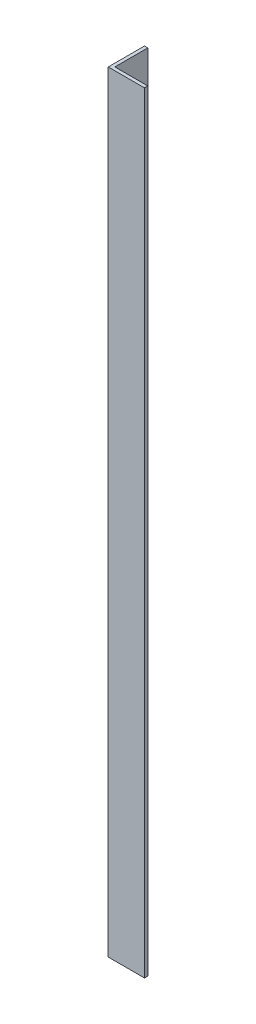
ISO-10303-21;
HEADER;
FILE_DESCRIPTION(('STEP AP214'),'2;1');
FILE_NAME('part.step','',(''),(''),'','','');
FILE_SCHEMA(('AUTOMOTIVE_DESIGN { 1 0 10303 214 1 1 1 1 }'));
ENDSEC;
DATA;
#1=APPLICATION_CONTEXT('core data for automotive mechanical design processes');
#2=APPLICATION_PROTOCOL_DEFINITION('international standard','automotive_design',2000,#1);
#3=PRODUCT_CONTEXT('',#1,'mechanical');
#4=PRODUCT('Part','Part','',(#3));
#5=PRODUCT_RELATED_PRODUCT_CATEGORY('part','',(#4));
#6=PRODUCT_DEFINITION_FORMATION('','',#4);
#7=PRODUCT_DEFINITION_CONTEXT('part definition',#1,'design');
#8=PRODUCT_DEFINITION('design','',#6,#7);
#9=PRODUCT_DEFINITION_SHAPE('','',#8);
#10=(LENGTH_UNIT() NAMED_UNIT(*) SI_UNIT(.MILLI.,.METRE.));
#11=(NAMED_UNIT(*) PLANE_ANGLE_UNIT() SI_UNIT($,.RADIAN.));
#12=(NAMED_UNIT(*) SI_UNIT($,.STERADIAN.) SOLID_ANGLE_UNIT());
#13=UNCERTAINTY_MEASURE_WITH_UNIT(LENGTH_MEASURE(1.E-05),#10,'distance_accuracy_value','');
#14=(GEOMETRIC_REPRESENTATION_CONTEXT(3) GLOBAL_UNCERTAINTY_ASSIGNED_CONTEXT((#13)) GLOBAL_UNIT_ASSIGNED_CONTEXT((#10,
#11,#12)) REPRESENTATION_CONTEXT('',''));
#15=CARTESIAN_POINT('',(0.,0.,0.));
#16=DIRECTION('',(0.,0.,1.));
#17=DIRECTION('',(1.,0.,0.));
#18=AXIS2_PLACEMENT_3D('',#15,#16,#17);
#19=CARTESIAN_POINT('',(-2.,508.,1.07187339486148));
#20=DIRECTION('',(0.,0.,1.));
#21=DIRECTION('',(1.,0.,0.));
#22=AXIS2_PLACEMENT_3D('',#19,#20,#21);
#23=PLANE('',#22);
#24=DIRECTION('',(-1.,0.,0.));
#25=VECTOR('',#24,1.);
#26=CARTESIAN_POINT('',(-2.,40.,1.07187339486148));
#27=LINE('',#26,#25);
#28=CARTESIAN_POINT('',(0.,40.,1.07187339486148));
#29=VERTEX_POINT('',#28);
#30=CARTESIAN_POINT('',(-2.,40.,1.07187339486148));
#31=VERTEX_POINT('',#30);
#32=EDGE_CURVE('E115',#29,#31,#27,.T.);
#33=ORIENTED_EDGE('',*,*,#32,.T.);
#34=DIRECTION('',(0.,-1.,0.));
#35=VECTOR('',#34,1.);
#36=CARTESIAN_POINT('',(-2.,508.,1.07187339486148));
#37=LINE('',#36,#35);
#38=CARTESIAN_POINT('',(-2.,508.,1.07187339486148));
#39=VERTEX_POINT('',#38);
#40=EDGE_CURVE('E11',#39,#31,#37,.T.);
#41=ORIENTED_EDGE('',*,*,#40,.F.);
#42=DIRECTION('',(-1.,0.,0.));
#43=VECTOR('',#42,1.);
#44=CARTESIAN_POINT('',(-2.,508.,1.07187339486148));
#45=LINE('',#44,#43);
#46=CARTESIAN_POINT('',(0.,508.,1.07187339486148));
#47=VERTEX_POINT('',#46);
#48=EDGE_CURVE('E125',#47,#39,#45,.T.);
#49=ORIENTED_EDGE('',*,*,#48,.F.);
#50=DIRECTION('',(0.,-1.,0.));
#51=VECTOR('',#50,1.);
#52=CARTESIAN_POINT('',(0.,508.,1.07187339486148));
#53=LINE('',#52,#51);
#54=EDGE_CURVE('E111',#47,#29,#53,.T.);
#55=ORIENTED_EDGE('',*,*,#54,.T.);
#56=EDGE_LOOP('',(#33,#41,#49,#55));
#57=FACE_BOUND('',#56,.T.);
#58=ADVANCED_FACE('F31',(#57),#23,.F.);
#59=CARTESIAN_POINT('',(-2.,508.,23.0718733948615));
#60=DIRECTION('',(1.,0.,0.));
#61=DIRECTION('',(0.,0.,-1.));
#62=AXIS2_PLACEMENT_3D('',#59,#60,#61);
#63=PLANE('',#62);
#64=DIRECTION('',(0.,0.,1.));
#65=VECTOR('',#64,1.);
#66=CARTESIAN_POINT('',(-2.,40.,23.0718733948615));
#67=LINE('',#66,#65);
#68=CARTESIAN_POINT('',(-2.,40.,23.0718733948615));
#69=VERTEX_POINT('',#68);
#70=EDGE_CURVE('E118',#31,#69,#67,.T.);
#71=ORIENTED_EDGE('',*,*,#70,.T.);
#72=DIRECTION('',(0.,-1.,0.));
#73=VECTOR('',#72,1.);
#74=CARTESIAN_POINT('',(-2.,508.,23.0718733948615));
#75=LINE('',#74,#73);
#76=CARTESIAN_POINT('',(-2.,508.,23.0718733948615));
#77=VERTEX_POINT('',#76);
#78=EDGE_CURVE('E39',#77,#69,#75,.T.);
#79=ORIENTED_EDGE('',*,*,#78,.F.);
#80=DIRECTION('',(0.,0.,1.));
#81=VECTOR('',#80,1.);
#82=CARTESIAN_POINT('',(-2.,508.,23.0718733948615));
#83=LINE('',#82,#81);
#84=EDGE_CURVE('E84',#39,#77,#83,.T.);
#85=ORIENTED_EDGE('',*,*,#84,.F.);
#86=ORIENTED_EDGE('',*,*,#40,.T.);
#87=EDGE_LOOP('',(#71,#79,#85,#86));
#88=FACE_BOUND('',#87,.T.);
#89=ADVANCED_FACE('F149',(#88),#63,.F.);
#90=CARTESIAN_POINT('',(20.,508.,23.0718733948615));
#91=DIRECTION('',(0.,0.,-1.));
#92=DIRECTION('',(-1.,0.,0.));
#93=AXIS2_PLACEMENT_3D('',#90,#91,#92);
#94=PLANE('',#93);
#95=DIRECTION('',(1.,0.,0.));
#96=VECTOR('',#95,1.);
#97=CARTESIAN_POINT('',(20.,40.,23.0718733948615));
#98=LINE('',#97,#96);
#99=CARTESIAN_POINT('',(20.,40.,23.0718733948615));
#100=VERTEX_POINT('',#99);
#101=EDGE_CURVE('E120',#69,#100,#98,.T.);
#102=ORIENTED_EDGE('',*,*,#101,.T.);
#103=DIRECTION('',(0.,-1.,0.));
#104=VECTOR('',#103,1.);
#105=CARTESIAN_POINT('',(20.,508.,23.0718733948615));
#106=LINE('',#105,#104);
#107=CARTESIAN_POINT('',(20.,508.,23.0718733948615));
#108=VERTEX_POINT('',#107);
#109=EDGE_CURVE('E106',#108,#100,#106,.T.);
#110=ORIENTED_EDGE('',*,*,#109,.F.);
#111=DIRECTION('',(1.,0.,0.));
#112=VECTOR('',#111,1.);
#113=CARTESIAN_POINT('',(20.,508.,23.0718733948615));
#114=LINE('',#113,#112);
#115=EDGE_CURVE('E97',#77,#108,#114,.T.);
#116=ORIENTED_EDGE('',*,*,#115,.F.);
#117=ORIENTED_EDGE('',*,*,#78,.T.);
#118=EDGE_LOOP('',(#102,#110,#116,#117));
#119=FACE_BOUND('',#118,.T.);
#120=ADVANCED_FACE('F131',(#119),#94,.F.);
#121=CARTESIAN_POINT('',(20.,508.,21.0718733948615));
#122=DIRECTION('',(-1.,0.,0.));
#123=DIRECTION('',(0.,0.,1.));
#124=AXIS2_PLACEMENT_3D('',#121,#122,#123);
#125=PLANE('',#124);
#126=DIRECTION('',(0.,0.,-1.));
#127=VECTOR('',#126,1.);
#128=CARTESIAN_POINT('',(20.,40.,21.0718733948615));
#129=LINE('',#128,#127);
#130=CARTESIAN_POINT('',(20.,40.,21.0718733948615));
#131=VERTEX_POINT('',#130);
#132=EDGE_CURVE('E105',#100,#131,#129,.T.);
#133=ORIENTED_EDGE('',*,*,#132,.T.);
#134=DIRECTION('',(0.,-1.,0.));
#135=VECTOR('',#134,1.);
#136=CARTESIAN_POINT('',(20.,508.,21.0718733948615));
#137=LINE('',#136,#135);
#138=CARTESIAN_POINT('',(20.,508.,21.0718733948615));
#139=VERTEX_POINT('',#138);
#140=EDGE_CURVE('E102',#139,#131,#137,.T.);
#141=ORIENTED_EDGE('',*,*,#140,.F.);
#142=DIRECTION('',(0.,0.,-1.));
#143=VECTOR('',#142,1.);
#144=CARTESIAN_POINT('',(20.,508.,21.0718733948615));
#145=LINE('',#144,#143);
#146=EDGE_CURVE('E91',#108,#139,#145,.T.);
#147=ORIENTED_EDGE('',*,*,#146,.F.);
#148=ORIENTED_EDGE('',*,*,#109,.T.);
#149=EDGE_LOOP('',(#133,#141,#147,#148));
#150=FACE_BOUND('',#149,.T.);
#151=ADVANCED_FACE('F103',(#150),#125,.F.);
#152=CARTESIAN_POINT('',(0.,508.,21.0718733948615));
#153=DIRECTION('',(0.,0.,1.));
#154=DIRECTION('',(1.,0.,0.));
#155=AXIS2_PLACEMENT_3D('',#152,#153,#154);
#156=PLANE('',#155);
#157=DIRECTION('',(-1.,0.,0.));
#158=VECTOR('',#157,1.);
#159=CARTESIAN_POINT('',(0.,40.,21.0718733948615));
#160=LINE('',#159,#158);
#161=CARTESIAN_POINT('',(0.,40.,21.0718733948615));
#162=VERTEX_POINT('',#161);
#163=EDGE_CURVE('E70',#131,#162,#160,.T.);
#164=ORIENTED_EDGE('',*,*,#163,.T.);
#165=DIRECTION('',(0.,-1.,0.));
#166=VECTOR('',#165,1.);
#167=CARTESIAN_POINT('',(0.,508.,21.0718733948615));
#168=LINE('',#167,#166);
#169=CARTESIAN_POINT('',(0.,508.,21.0718733948615));
#170=VERTEX_POINT('',#169);
#171=EDGE_CURVE('E107',#170,#162,#168,.T.);
#172=ORIENTED_EDGE('',*,*,#171,.F.);
#173=DIRECTION('',(-1.,0.,0.));
#174=VECTOR('',#173,1.);
#175=CARTESIAN_POINT('',(0.,508.,21.0718733948615));
#176=LINE('',#175,#174);
#177=EDGE_CURVE('E95',#139,#170,#176,.T.);
#178=ORIENTED_EDGE('',*,*,#177,.F.);
#179=ORIENTED_EDGE('',*,*,#140,.T.);
#180=EDGE_LOOP('',(#164,#172,#178,#179));
#181=FACE_BOUND('',#180,.T.);
#182=ADVANCED_FACE('F109',(#181),#156,.F.);
#183=CARTESIAN_POINT('',(0.,508.,1.07187339486148));
#184=DIRECTION('',(-1.,0.,0.));
#185=DIRECTION('',(0.,0.,1.));
#186=AXIS2_PLACEMENT_3D('',#183,#184,#185);
#187=PLANE('',#186);
#188=DIRECTION('',(0.,0.,-1.));
#189=VECTOR('',#188,1.);
#190=CARTESIAN_POINT('',(0.,40.,1.07187339486148));
#191=LINE('',#190,#189);
#192=EDGE_CURVE('E76',#162,#29,#191,.T.);
#193=ORIENTED_EDGE('',*,*,#192,.T.);
#194=ORIENTED_EDGE('',*,*,#54,.F.);
#195=DIRECTION('',(0.,0.,-1.));
#196=VECTOR('',#195,1.);
#197=CARTESIAN_POINT('',(0.,508.,1.07187339486148));
#198=LINE('',#197,#196);
#199=EDGE_CURVE('E47',#170,#47,#198,.T.);
#200=ORIENTED_EDGE('',*,*,#199,.F.);
#201=ORIENTED_EDGE('',*,*,#171,.T.);
#202=EDGE_LOOP('',(#193,#194,#200,#201));
#203=FACE_BOUND('',#202,.T.);
#204=ADVANCED_FACE('F138',(#203),#187,.F.);
#205=CARTESIAN_POINT('',(0.,508.,1.07187339486148));
#206=DIRECTION('',(0.,-1.,0.));
#207=DIRECTION('',(0.,0.,-1.));
#208=AXIS2_PLACEMENT_3D('',#205,#206,#207);
#209=PLANE('',#208);
#210=ORIENTED_EDGE('',*,*,#48,.T.);
#211=ORIENTED_EDGE('',*,*,#84,.T.);
#212=ORIENTED_EDGE('',*,*,#115,.T.);
#213=ORIENTED_EDGE('',*,*,#146,.T.);
#214=ORIENTED_EDGE('',*,*,#177,.T.);
#215=ORIENTED_EDGE('',*,*,#199,.T.);
#216=EDGE_LOOP('',(#210,#211,#212,#213,#214,#215));
#217=FACE_BOUND('',#216,.T.);
#218=ADVANCED_FACE('F93',(#217),#209,.F.);
#219=CARTESIAN_POINT('',(0.,40.,1.07187339486148));
#220=DIRECTION('',(0.,-1.,0.));
#221=DIRECTION('',(0.,0.,-1.));
#222=AXIS2_PLACEMENT_3D('',#219,#220,#221);
#223=PLANE('',#222);
#224=ORIENTED_EDGE('',*,*,#32,.F.);
#225=ORIENTED_EDGE('',*,*,#192,.F.);
#226=ORIENTED_EDGE('',*,*,#163,.F.);
#227=ORIENTED_EDGE('',*,*,#132,.F.);
#228=ORIENTED_EDGE('',*,*,#101,.F.);
#229=ORIENTED_EDGE('',*,*,#70,.F.);
#230=EDGE_LOOP('',(#224,#225,#226,#227,#228,#229));
#231=FACE_BOUND('',#230,.T.);
#232=ADVANCED_FACE('F134',(#231),#223,.T.);
#233=CLOSED_SHELL('',(#58,#89,#120,#151,#182,#204,#218,#232));
#234=MANIFOLD_SOLID_BREP('B2',#233);
#235=ADVANCED_BREP_SHAPE_REPRESENTATION('',(#18,#234),#14);
#236=SHAPE_DEFINITION_REPRESENTATION(#9,#235);
ENDSEC;
END-ISO-10303-21;
